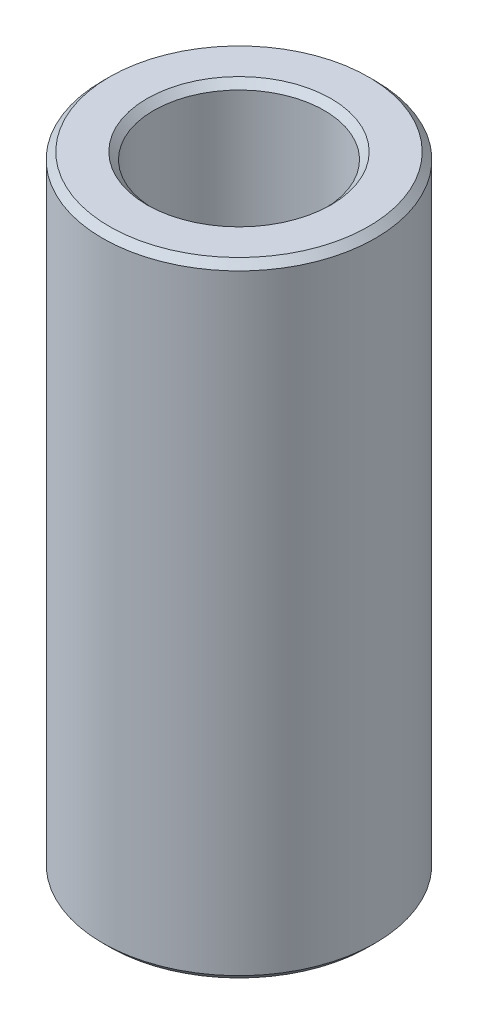
ISO-10303-21;
HEADER;
FILE_DESCRIPTION(('STEP AP214'),'2;1');
FILE_NAME('part.step','',(''),(''),'','','');
FILE_SCHEMA(('AUTOMOTIVE_DESIGN { 1 0 10303 214 1 1 1 1 }'));
ENDSEC;
DATA;
#1=APPLICATION_CONTEXT('core data for automotive mechanical design processes');
#2=APPLICATION_PROTOCOL_DEFINITION('international standard','automotive_design',2000,#1);
#3=PRODUCT_CONTEXT('',#1,'mechanical');
#4=PRODUCT('Part','Part','',(#3));
#5=PRODUCT_RELATED_PRODUCT_CATEGORY('part','',(#4));
#6=PRODUCT_DEFINITION_FORMATION('','',#4);
#7=PRODUCT_DEFINITION_CONTEXT('part definition',#1,'design');
#8=PRODUCT_DEFINITION('design','',#6,#7);
#9=PRODUCT_DEFINITION_SHAPE('','',#8);
#10=(LENGTH_UNIT() NAMED_UNIT(*) SI_UNIT(.MILLI.,.METRE.));
#11=(NAMED_UNIT(*) PLANE_ANGLE_UNIT() SI_UNIT($,.RADIAN.));
#12=(NAMED_UNIT(*) SI_UNIT($,.STERADIAN.) SOLID_ANGLE_UNIT());
#13=UNCERTAINTY_MEASURE_WITH_UNIT(LENGTH_MEASURE(1.E-05),#10,'distance_accuracy_value','');
#14=(GEOMETRIC_REPRESENTATION_CONTEXT(3) GLOBAL_UNCERTAINTY_ASSIGNED_CONTEXT((#13)) GLOBAL_UNIT_ASSIGNED_CONTEXT((#10,
#11,#12)) REPRESENTATION_CONTEXT('',''));
#15=CARTESIAN_POINT('',(0.,0.,0.));
#16=DIRECTION('',(0.,0.,1.));
#17=DIRECTION('',(1.,0.,0.));
#18=AXIS2_PLACEMENT_3D('',#15,#16,#17);
#19=CARTESIAN_POINT('',(21.,0.1,-21.));
#20=DIRECTION('',(0.,1.,0.));
#21=DIRECTION('',(1.,0.,0.));
#22=AXIS2_PLACEMENT_3D('',#19,#20,#21);
#23=CONICAL_SURFACE('',#22,3.9,0.785398163397449);
#24=CARTESIAN_POINT('',(21.,0.2,-21.));
#25=DIRECTION('',(0.,-1.,0.));
#26=DIRECTION('',(1.,0.,0.));
#27=AXIS2_PLACEMENT_3D('',#24,#25,#26);
#28=CIRCLE('',#27,4.);
#29=CARTESIAN_POINT('',(17.,0.2,-21.));
#30=VERTEX_POINT('',#29);
#31=EDGE_CURVE('E97',#30,#30,#28,.T.);
#32=ORIENTED_EDGE('',*,*,#31,.T.);
#33=DIRECTION('',(0.707106781186548,-0.707106781186547,0.));
#34=VECTOR('',#33,1.);
#35=CARTESIAN_POINT('',(17.1,0.1,-21.));
#36=LINE('',#35,#34);
#37=CARTESIAN_POINT('',(17.2,0.,-21.));
#38=VERTEX_POINT('',#37);
#39=EDGE_CURVE('E11',#30,#38,#36,.T.);
#40=ORIENTED_EDGE('',*,*,#39,.T.);
#41=CARTESIAN_POINT('',(21.,0.,-21.));
#42=DIRECTION('',(0.,1.,0.));
#43=DIRECTION('',(1.,0.,0.));
#44=AXIS2_PLACEMENT_3D('',#41,#42,#43);
#45=CIRCLE('',#44,3.8);
#46=EDGE_CURVE('E28',#38,#38,#45,.T.);
#47=ORIENTED_EDGE('',*,*,#46,.T.);
#48=ORIENTED_EDGE('',*,*,#39,.F.);
#49=EDGE_LOOP('',(#32,#40,#47,#48));
#50=FACE_BOUND('',#49,.T.);
#51=ADVANCED_FACE('F17',(#50),#23,.T.);
#52=CARTESIAN_POINT('',(21.,0.,-21.));
#53=DIRECTION('',(0.,1.,0.));
#54=DIRECTION('',(1.,0.,0.));
#55=AXIS2_PLACEMENT_3D('',#52,#53,#54);
#56=PLANE('',#55);
#57=CARTESIAN_POINT('',(21.,0.,-21.));
#58=DIRECTION('',(0.,-1.,0.));
#59=DIRECTION('',(1.,0.,0.));
#60=AXIS2_PLACEMENT_3D('',#57,#58,#59);
#61=CIRCLE('',#60,2.7);
#62=CARTESIAN_POINT('',(18.3,0.,-21.));
#63=VERTEX_POINT('',#62);
#64=EDGE_CURVE('E104',#63,#63,#61,.T.);
#65=ORIENTED_EDGE('',*,*,#64,.F.);
#66=EDGE_LOOP('',(#65));
#67=FACE_BOUND('',#66,.T.);
#68=ORIENTED_EDGE('',*,*,#46,.F.);
#69=EDGE_LOOP('',(#68));
#70=FACE_BOUND('',#69,.T.);
#71=ADVANCED_FACE('F19',(#67,#70),#56,.F.);
#72=CARTESIAN_POINT('',(21.,0.1,-21.));
#73=DIRECTION('',(0.,-1.,0.));
#74=DIRECTION('',(1.,0.,0.));
#75=AXIS2_PLACEMENT_3D('',#72,#73,#74);
#76=CONICAL_SURFACE('',#75,2.6,0.785398163397449);
#77=CARTESIAN_POINT('',(21.,0.2,-21.));
#78=DIRECTION('',(0.,1.,0.));
#79=DIRECTION('',(1.,0.,0.));
#80=AXIS2_PLACEMENT_3D('',#77,#78,#79);
#81=CIRCLE('',#80,2.5);
#82=CARTESIAN_POINT('',(18.5,0.2,-21.));
#83=VERTEX_POINT('',#82);
#84=EDGE_CURVE('E109',#83,#83,#81,.T.);
#85=ORIENTED_EDGE('',*,*,#84,.T.);
#86=DIRECTION('',(-0.707106781186548,-0.707106781186547,0.));
#87=VECTOR('',#86,1.);
#88=CARTESIAN_POINT('',(18.4,0.1,-21.));
#89=LINE('',#88,#87);
#90=EDGE_CURVE('E21',#83,#63,#89,.T.);
#91=ORIENTED_EDGE('',*,*,#90,.T.);
#92=ORIENTED_EDGE('',*,*,#64,.T.);
#93=ORIENTED_EDGE('',*,*,#90,.F.);
#94=EDGE_LOOP('',(#85,#91,#92,#93));
#95=FACE_BOUND('',#94,.T.);
#96=ADVANCED_FACE('F148',(#95),#76,.F.);
#97=CARTESIAN_POINT('',(21.,0.,-21.));
#98=DIRECTION('',(0.,1.,0.));
#99=DIRECTION('',(1.,0.,0.));
#100=AXIS2_PLACEMENT_3D('',#97,#98,#99);
#101=CYLINDRICAL_SURFACE('',#100,2.5);
#102=CARTESIAN_POINT('',(21.,18.1,-21.));
#103=DIRECTION('',(0.,-1.,0.));
#104=DIRECTION('',(1.,0.,0.));
#105=AXIS2_PLACEMENT_3D('',#102,#103,#104);
#106=CIRCLE('',#105,2.5);
#107=CARTESIAN_POINT('',(18.5,18.1,-21.));
#108=VERTEX_POINT('',#107);
#109=EDGE_CURVE('E101',#108,#108,#106,.T.);
#110=ORIENTED_EDGE('',*,*,#109,.F.);
#111=DIRECTION('',(0.,-1.,0.));
#112=VECTOR('',#111,1.);
#113=CARTESIAN_POINT('',(18.5,0.,-21.));
#114=LINE('',#113,#112);
#115=EDGE_CURVE('E55',#108,#83,#114,.T.);
#116=ORIENTED_EDGE('',*,*,#115,.T.);
#117=ORIENTED_EDGE('',*,*,#84,.F.);
#118=ORIENTED_EDGE('',*,*,#115,.F.);
#119=EDGE_LOOP('',(#110,#116,#117,#118));
#120=FACE_BOUND('',#119,.T.);
#121=ADVANCED_FACE('F152',(#120),#101,.F.);
#122=CARTESIAN_POINT('',(21.,18.2,-21.));
#123=DIRECTION('',(0.,1.,0.));
#124=DIRECTION('',(1.,0.,0.));
#125=AXIS2_PLACEMENT_3D('',#122,#123,#124);
#126=CONICAL_SURFACE('',#125,2.6,0.785398163397448);
#127=CARTESIAN_POINT('',(21.,18.3,-21.));
#128=DIRECTION('',(0.,1.,0.));
#129=DIRECTION('',(1.,0.,0.));
#130=AXIS2_PLACEMENT_3D('',#127,#128,#129);
#131=CIRCLE('',#130,2.7);
#132=CARTESIAN_POINT('',(18.3,18.3,-21.));
#133=VERTEX_POINT('',#132);
#134=EDGE_CURVE('E93',#133,#133,#131,.T.);
#135=ORIENTED_EDGE('',*,*,#134,.T.);
#136=DIRECTION('',(0.707106781186548,-0.707106781186548,0.));
#137=VECTOR('',#136,1.);
#138=CARTESIAN_POINT('',(18.4,18.2,-21.));
#139=LINE('',#138,#137);
#140=EDGE_CURVE('E70',#133,#108,#139,.T.);
#141=ORIENTED_EDGE('',*,*,#140,.T.);
#142=ORIENTED_EDGE('',*,*,#109,.T.);
#143=ORIENTED_EDGE('',*,*,#140,.F.);
#144=EDGE_LOOP('',(#135,#141,#142,#143));
#145=FACE_BOUND('',#144,.T.);
#146=ADVANCED_FACE('F126',(#145),#126,.F.);
#147=CARTESIAN_POINT('',(21.,0.,-21.));
#148=DIRECTION('',(0.,1.,0.));
#149=DIRECTION('',(1.,0.,0.));
#150=AXIS2_PLACEMENT_3D('',#147,#148,#149);
#151=CYLINDRICAL_SURFACE('',#150,4.);
#152=CARTESIAN_POINT('',(21.,18.1,-21.));
#153=DIRECTION('',(0.,1.,0.));
#154=DIRECTION('',(1.,0.,0.));
#155=AXIS2_PLACEMENT_3D('',#152,#153,#154);
#156=CIRCLE('',#155,4.);
#157=CARTESIAN_POINT('',(17.,18.1,-21.));
#158=VERTEX_POINT('',#157);
#159=EDGE_CURVE('E85',#158,#158,#156,.T.);
#160=ORIENTED_EDGE('',*,*,#159,.F.);
#161=DIRECTION('',(0.,-1.,0.));
#162=VECTOR('',#161,1.);
#163=CARTESIAN_POINT('',(17.,0.,-21.));
#164=LINE('',#163,#162);
#165=EDGE_CURVE('E100',#158,#30,#164,.T.);
#166=ORIENTED_EDGE('',*,*,#165,.T.);
#167=ORIENTED_EDGE('',*,*,#31,.F.);
#168=ORIENTED_EDGE('',*,*,#165,.F.);
#169=EDGE_LOOP('',(#160,#166,#167,#168));
#170=FACE_BOUND('',#169,.T.);
#171=ADVANCED_FACE('F131',(#170),#151,.T.);
#172=CARTESIAN_POINT('',(21.,18.3,-21.));
#173=DIRECTION('',(0.,1.,0.));
#174=DIRECTION('',(1.,0.,0.));
#175=AXIS2_PLACEMENT_3D('',#172,#173,#174);
#176=PLANE('',#175);
#177=ORIENTED_EDGE('',*,*,#134,.F.);
#178=EDGE_LOOP('',(#177));
#179=FACE_BOUND('',#178,.T.);
#180=CARTESIAN_POINT('',(21.,18.3,-21.));
#181=DIRECTION('',(0.,-1.,0.));
#182=DIRECTION('',(1.,0.,0.));
#183=AXIS2_PLACEMENT_3D('',#180,#181,#182);
#184=CIRCLE('',#183,3.8);
#185=CARTESIAN_POINT('',(17.2,18.3,-21.));
#186=VERTEX_POINT('',#185);
#187=EDGE_CURVE('E83',#186,#186,#184,.T.);
#188=ORIENTED_EDGE('',*,*,#187,.F.);
#189=EDGE_LOOP('',(#188));
#190=FACE_BOUND('',#189,.T.);
#191=ADVANCED_FACE('F128',(#179,#190),#176,.T.);
#192=CARTESIAN_POINT('',(21.,18.2,-21.));
#193=DIRECTION('',(0.,-1.,0.));
#194=DIRECTION('',(1.,0.,0.));
#195=AXIS2_PLACEMENT_3D('',#192,#193,#194);
#196=CONICAL_SURFACE('',#195,3.9,0.785398163397448);
#197=ORIENTED_EDGE('',*,*,#187,.T.);
#198=DIRECTION('',(-0.707106781186548,-0.707106781186548,0.));
#199=VECTOR('',#198,1.);
#200=CARTESIAN_POINT('',(17.1,18.2,-21.));
#201=LINE('',#200,#199);
#202=EDGE_CURVE('E80',#186,#158,#201,.T.);
#203=ORIENTED_EDGE('',*,*,#202,.T.);
#204=ORIENTED_EDGE('',*,*,#159,.T.);
#205=ORIENTED_EDGE('',*,*,#202,.F.);
#206=EDGE_LOOP('',(#197,#203,#204,#205));
#207=FACE_BOUND('',#206,.T.);
#208=ADVANCED_FACE('F81',(#207),#196,.T.);
#209=CLOSED_SHELL('',(#51,#71,#96,#121,#146,#171,#191,#208));
#210=MANIFOLD_SOLID_BREP('B1',#209);
#211=ADVANCED_BREP_SHAPE_REPRESENTATION('',(#18,#210),#14);
#212=SHAPE_DEFINITION_REPRESENTATION(#9,#211);
ENDSEC;
END-ISO-10303-21;
